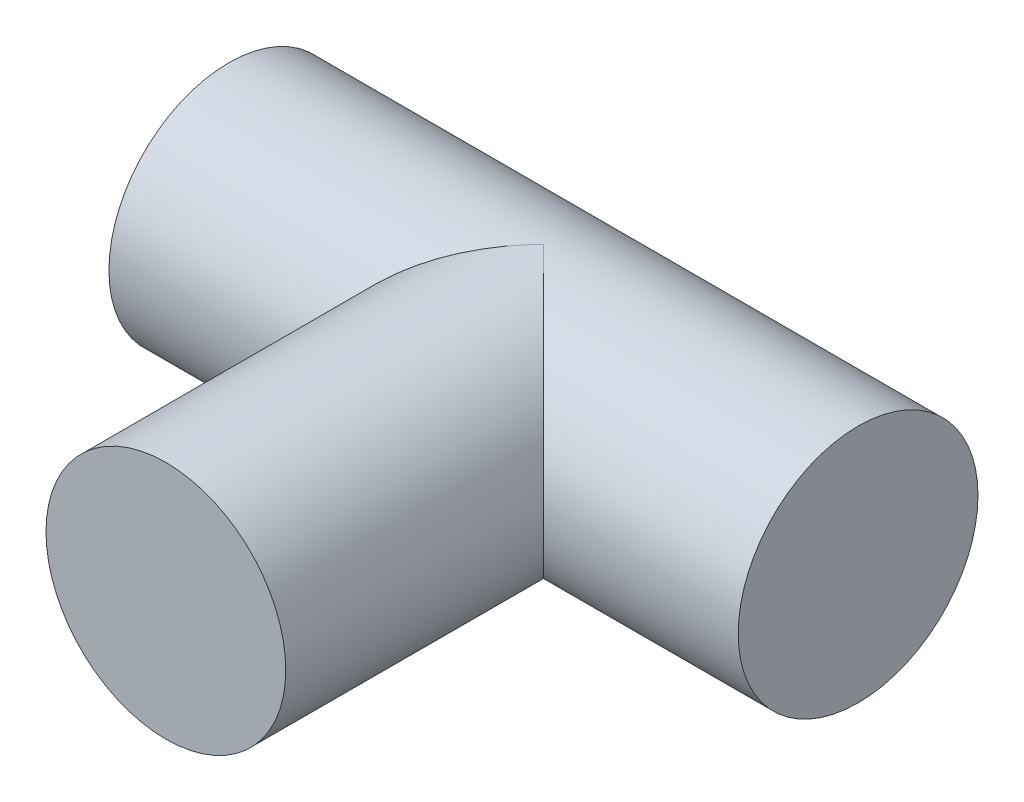
ISO-10303-21;
HEADER;
FILE_DESCRIPTION(('STEP AP214'),'2;1');
FILE_NAME('part.step','',(''),(''),'','','');
FILE_SCHEMA(('AUTOMOTIVE_DESIGN { 1 0 10303 214 1 1 1 1 }'));
ENDSEC;
DATA;
#1=APPLICATION_CONTEXT('core data for automotive mechanical design processes');
#2=APPLICATION_PROTOCOL_DEFINITION('international standard','automotive_design',2000,#1);
#3=PRODUCT_CONTEXT('',#1,'mechanical');
#4=PRODUCT('Part','Part','',(#3));
#5=PRODUCT_RELATED_PRODUCT_CATEGORY('part','',(#4));
#6=PRODUCT_DEFINITION_FORMATION('','',#4);
#7=PRODUCT_DEFINITION_CONTEXT('part definition',#1,'design');
#8=PRODUCT_DEFINITION('design','',#6,#7);
#9=PRODUCT_DEFINITION_SHAPE('','',#8);
#10=(LENGTH_UNIT() NAMED_UNIT(*) SI_UNIT(.MILLI.,.METRE.));
#11=(NAMED_UNIT(*) PLANE_ANGLE_UNIT() SI_UNIT($,.RADIAN.));
#12=(NAMED_UNIT(*) SI_UNIT($,.STERADIAN.) SOLID_ANGLE_UNIT());
#13=UNCERTAINTY_MEASURE_WITH_UNIT(LENGTH_MEASURE(1.E-05),#10,'distance_accuracy_value','');
#14=(GEOMETRIC_REPRESENTATION_CONTEXT(3) GLOBAL_UNCERTAINTY_ASSIGNED_CONTEXT((#13)) GLOBAL_UNIT_ASSIGNED_CONTEXT((#10,
#11,#12)) REPRESENTATION_CONTEXT('',''));
#15=CARTESIAN_POINT('',(0.,0.,0.));
#16=DIRECTION('',(0.,0.,1.));
#17=DIRECTION('',(1.,0.,0.));
#18=AXIS2_PLACEMENT_3D('',#15,#16,#17);
#19=CARTESIAN_POINT('',(0.,0.,30.));
#20=DIRECTION('',(0.,0.,-1.));
#21=DIRECTION('',(-1.,0.,0.));
#22=AXIS2_PLACEMENT_3D('',#19,#20,#21);
#23=CYLINDRICAL_SURFACE('',#22,9.525);
#24=CARTESIAN_POINT('',(0.,0.,30.));
#25=DIRECTION('',(0.,0.,1.));
#26=DIRECTION('',(1.,0.,0.));
#27=AXIS2_PLACEMENT_3D('',#24,#25,#26);
#28=CIRCLE('',#27,9.525);
#29=CARTESIAN_POINT('',(9.525,0.,30.));
#30=VERTEX_POINT('',#29);
#31=EDGE_CURVE('E11',#30,#30,#28,.T.);
#32=ORIENTED_EDGE('',*,*,#31,.F.);
#33=EDGE_LOOP('',(#32));
#34=FACE_BOUND('',#33,.T.);
#35=CARTESIAN_POINT('',(0.,0.,0.));
#36=DIRECTION('',(-0.707106781186547,0.,-0.707106781186547));
#37=DIRECTION('',(0.707106781186547,0.,-0.707106781186547));
#38=AXIS2_PLACEMENT_3D('',#35,#36,#37);
#39=ELLIPSE('',#38,13.4703841816037,9.525);
#40=CARTESIAN_POINT('',(0.,-9.525,0.));
#41=VERTEX_POINT('',#40);
#42=CARTESIAN_POINT('',(0.,9.525,0.));
#43=VERTEX_POINT('',#42);
#44=EDGE_CURVE('E40',#41,#43,#39,.T.);
#45=ORIENTED_EDGE('',*,*,#44,.F.);
#46=CARTESIAN_POINT('',(0.,0.,0.));
#47=DIRECTION('',(0.707106781186547,0.,-0.707106781186547));
#48=DIRECTION('',(-0.707106781186547,0.,-0.707106781186547));
#49=AXIS2_PLACEMENT_3D('',#46,#47,#48);
#50=ELLIPSE('',#49,13.4703841816037,9.525);
#51=EDGE_CURVE('E46',#43,#41,#50,.T.);
#52=ORIENTED_EDGE('',*,*,#51,.F.);
#53=EDGE_LOOP('',(#45,#52));
#54=FACE_BOUND('',#53,.T.);
#55=ADVANCED_FACE('F33',(#34,#54),#23,.T.);
#56=CARTESIAN_POINT('',(0.,0.,30.));
#57=DIRECTION('',(0.,0.,1.));
#58=DIRECTION('',(1.,0.,0.));
#59=AXIS2_PLACEMENT_3D('',#56,#57,#58);
#60=PLANE('',#59);
#61=ORIENTED_EDGE('',*,*,#31,.T.);
#62=EDGE_LOOP('',(#61));
#63=FACE_BOUND('',#62,.T.);
#64=ADVANCED_FACE('F71',(#63),#60,.T.);
#65=CARTESIAN_POINT('',(25.,0.,0.));
#66=DIRECTION('',(-1.,0.,0.));
#67=DIRECTION('',(0.,0.,1.));
#68=AXIS2_PLACEMENT_3D('',#65,#66,#67);
#69=CYLINDRICAL_SURFACE('',#68,9.525);
#70=CARTESIAN_POINT('',(25.,0.,0.));
#71=DIRECTION('',(1.,0.,0.));
#72=DIRECTION('',(0.,0.,-1.));
#73=AXIS2_PLACEMENT_3D('',#70,#71,#72);
#74=CIRCLE('',#73,9.525);
#75=CARTESIAN_POINT('',(25.,0.,-9.525));
#76=VERTEX_POINT('',#75);
#77=EDGE_CURVE('E50',#76,#76,#74,.T.);
#78=ORIENTED_EDGE('',*,*,#77,.F.);
#79=EDGE_LOOP('',(#78));
#80=FACE_BOUND('',#79,.T.);
#81=CARTESIAN_POINT('',(-25.,0.,0.));
#82=DIRECTION('',(1.,0.,0.));
#83=DIRECTION('',(0.,0.,-1.));
#84=AXIS2_PLACEMENT_3D('',#81,#82,#83);
#85=CIRCLE('',#84,9.525);
#86=CARTESIAN_POINT('',(-25.,0.,-9.525));
#87=VERTEX_POINT('',#86);
#88=EDGE_CURVE('E53',#87,#87,#85,.T.);
#89=ORIENTED_EDGE('',*,*,#88,.T.);
#90=EDGE_LOOP('',(#89));
#91=FACE_BOUND('',#90,.T.);
#92=ORIENTED_EDGE('',*,*,#51,.T.);
#93=ORIENTED_EDGE('',*,*,#44,.T.);
#94=EDGE_LOOP('',(#92,#93));
#95=FACE_BOUND('',#94,.T.);
#96=ADVANCED_FACE('F49',(#80,#91,#95),#69,.T.);
#97=CARTESIAN_POINT('',(25.,0.,0.));
#98=DIRECTION('',(1.,0.,0.));
#99=DIRECTION('',(0.,0.,-1.));
#100=AXIS2_PLACEMENT_3D('',#97,#98,#99);
#101=PLANE('',#100);
#102=ORIENTED_EDGE('',*,*,#77,.T.);
#103=EDGE_LOOP('',(#102));
#104=FACE_BOUND('',#103,.T.);
#105=ADVANCED_FACE('F62',(#104),#101,.T.);
#106=CARTESIAN_POINT('',(-25.,0.,0.));
#107=DIRECTION('',(1.,0.,0.));
#108=DIRECTION('',(0.,0.,-1.));
#109=AXIS2_PLACEMENT_3D('',#106,#107,#108);
#110=PLANE('',#109);
#111=ORIENTED_EDGE('',*,*,#88,.F.);
#112=EDGE_LOOP('',(#111));
#113=FACE_BOUND('',#112,.T.);
#114=ADVANCED_FACE('F60',(#113),#110,.F.);
#115=CLOSED_SHELL('',(#55,#64,#96,#105,#114));
#116=MANIFOLD_SOLID_BREP('B2',#115);
#117=ADVANCED_BREP_SHAPE_REPRESENTATION('',(#18,#116),#14);
#118=SHAPE_DEFINITION_REPRESENTATION(#9,#117);
ENDSEC;
END-ISO-10303-21;
